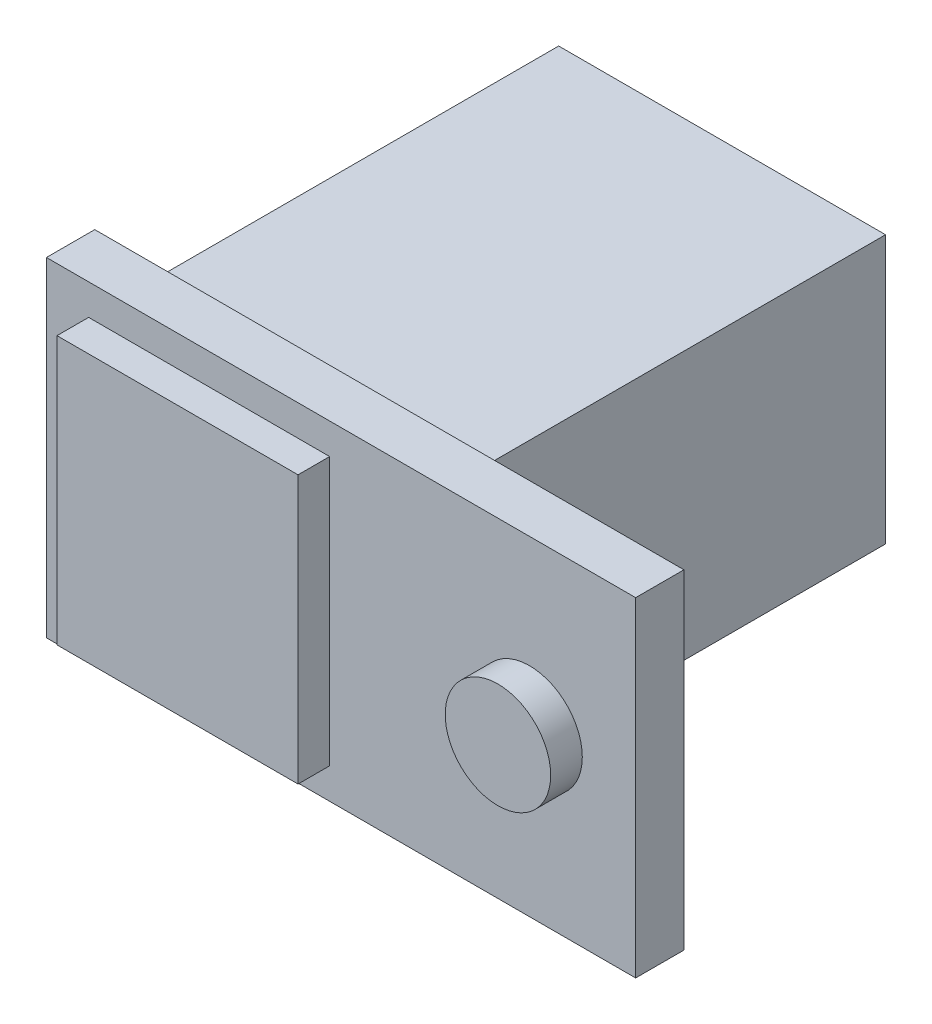
ISO-10303-21;
HEADER;
FILE_DESCRIPTION(('STEP AP214'),'2;1');
FILE_NAME('part.step','',(''),(''),'','','');
FILE_SCHEMA(('AUTOMOTIVE_DESIGN { 1 0 10303 214 1 1 1 1 }'));
ENDSEC;
DATA;
#1=APPLICATION_CONTEXT('core data for automotive mechanical design processes');
#2=APPLICATION_PROTOCOL_DEFINITION('international standard','automotive_design',2000,#1);
#3=PRODUCT_CONTEXT('',#1,'mechanical');
#4=PRODUCT('Part','Part','',(#3));
#5=PRODUCT_RELATED_PRODUCT_CATEGORY('part','',(#4));
#6=PRODUCT_DEFINITION_FORMATION('','',#4);
#7=PRODUCT_DEFINITION_CONTEXT('part definition',#1,'design');
#8=PRODUCT_DEFINITION('design','',#6,#7);
#9=PRODUCT_DEFINITION_SHAPE('','',#8);
#10=(LENGTH_UNIT() NAMED_UNIT(*) SI_UNIT(.MILLI.,.METRE.));
#11=(NAMED_UNIT(*) PLANE_ANGLE_UNIT() SI_UNIT($,.RADIAN.));
#12=(NAMED_UNIT(*) SI_UNIT($,.STERADIAN.) SOLID_ANGLE_UNIT());
#13=UNCERTAINTY_MEASURE_WITH_UNIT(LENGTH_MEASURE(1.E-05),#10,'distance_accuracy_value','');
#14=(GEOMETRIC_REPRESENTATION_CONTEXT(3) GLOBAL_UNCERTAINTY_ASSIGNED_CONTEXT((#13)) GLOBAL_UNIT_ASSIGNED_CONTEXT((#10,
#11,#12)) REPRESENTATION_CONTEXT('',''));
#15=CARTESIAN_POINT('',(0.,0.,0.));
#16=DIRECTION('',(0.,0.,1.));
#17=DIRECTION('',(1.,0.,0.));
#18=AXIS2_PLACEMENT_3D('',#15,#16,#17);
#19=CARTESIAN_POINT('',(7.715,7.81,3.79));
#20=DIRECTION('',(0.,0.,1.));
#21=DIRECTION('',(1.,0.,0.));
#22=AXIS2_PLACEMENT_3D('',#19,#20,#21);
#23=PLANE('',#22);
#24=DIRECTION('',(0.,1.,0.));
#25=VECTOR('',#24,1.);
#26=CARTESIAN_POINT('',(2.,1.46,3.79));
#27=LINE('',#26,#25);
#28=CARTESIAN_POINT('',(2.,1.46,3.79));
#29=VERTEX_POINT('',#28);
#30=CARTESIAN_POINT('',(2.,14.16,3.79));
#31=VERTEX_POINT('',#30);
#32=EDGE_CURVE('E129',#29,#31,#27,.T.);
#33=ORIENTED_EDGE('',*,*,#32,.F.);
#34=DIRECTION('',(1.,0.,0.));
#35=VECTOR('',#34,1.);
#36=CARTESIAN_POINT('',(13.43,1.46,3.79));
#37=LINE('',#36,#35);
#38=CARTESIAN_POINT('',(13.43,1.46,3.79));
#39=VERTEX_POINT('',#38);
#40=EDGE_CURVE('E131',#39,#29,#37,.F.);
#41=ORIENTED_EDGE('',*,*,#40,.F.);
#42=DIRECTION('',(0.,1.,0.));
#43=VECTOR('',#42,1.);
#44=CARTESIAN_POINT('',(13.43,14.16,3.79));
#45=LINE('',#44,#43);
#46=CARTESIAN_POINT('',(13.43,14.16,3.79));
#47=VERTEX_POINT('',#46);
#48=EDGE_CURVE('E133',#47,#39,#45,.F.);
#49=ORIENTED_EDGE('',*,*,#48,.F.);
#50=DIRECTION('',(1.,0.,0.));
#51=VECTOR('',#50,1.);
#52=CARTESIAN_POINT('',(2.,14.16,3.79));
#53=LINE('',#52,#51);
#54=EDGE_CURVE('E193',#31,#47,#53,.T.);
#55=ORIENTED_EDGE('',*,*,#54,.F.);
#56=EDGE_LOOP('',(#33,#41,#49,#55));
#57=FACE_BOUND('',#56,.T.);
#58=ADVANCED_FACE('F17',(#57),#23,.T.);
#59=CARTESIAN_POINT('',(22.91,7.81,3.79));
#60=DIRECTION('',(0.,0.,-1.));
#61=DIRECTION('',(-1.,0.,0.));
#62=AXIS2_PLACEMENT_3D('',#59,#60,#61);
#63=PLANE('',#62);
#64=CARTESIAN_POINT('',(22.91,7.81,3.79));
#65=DIRECTION('',(0.,0.,1.));
#66=DIRECTION('',(1.,0.,0.));
#67=AXIS2_PLACEMENT_3D('',#64,#65,#66);
#68=CIRCLE('',#67,2.5);
#69=CARTESIAN_POINT('',(25.41,7.81,3.79));
#70=VERTEX_POINT('',#69);
#71=EDGE_CURVE('E20',#70,#70,#68,.F.);
#72=ORIENTED_EDGE('',*,*,#71,.F.);
#73=EDGE_LOOP('',(#72));
#74=FACE_BOUND('',#73,.T.);
#75=ADVANCED_FACE('F378',(#74),#63,.F.);
#76=CARTESIAN_POINT('',(13.43,14.16,2.29));
#77=DIRECTION('',(1.,0.,0.));
#78=DIRECTION('',(0.,0.,-1.));
#79=AXIS2_PLACEMENT_3D('',#76,#77,#78);
#80=PLANE('',#79);
#81=DIRECTION('',(0.,1.,0.));
#82=VECTOR('',#81,1.);
#83=CARTESIAN_POINT('',(13.43,7.81,2.29));
#84=LINE('',#83,#82);
#85=CARTESIAN_POINT('',(13.43,14.16,2.29));
#86=VERTEX_POINT('',#85);
#87=CARTESIAN_POINT('',(13.43,1.46,2.29));
#88=VERTEX_POINT('',#87);
#89=EDGE_CURVE('E185',#86,#88,#84,.F.);
#90=ORIENTED_EDGE('',*,*,#89,.F.);
#91=DIRECTION('',(0.,0.,1.));
#92=VECTOR('',#91,1.);
#93=CARTESIAN_POINT('',(13.43,14.16,2.29));
#94=LINE('',#93,#92);
#95=EDGE_CURVE('E145',#47,#86,#94,.F.);
#96=ORIENTED_EDGE('',*,*,#95,.F.);
#97=ORIENTED_EDGE('',*,*,#48,.T.);
#98=DIRECTION('',(0.,0.,-1.));
#99=VECTOR('',#98,1.);
#100=CARTESIAN_POINT('',(13.43,1.46,2.29));
#101=LINE('',#100,#99);
#102=EDGE_CURVE('E139',#88,#39,#101,.F.);
#103=ORIENTED_EDGE('',*,*,#102,.F.);
#104=EDGE_LOOP('',(#90,#96,#97,#103));
#105=FACE_BOUND('',#104,.T.);
#106=ADVANCED_FACE('F142',(#105),#80,.T.);
#107=CARTESIAN_POINT('',(13.43,1.46,2.29));
#108=DIRECTION('',(0.,-1.,0.));
#109=DIRECTION('',(0.,0.,-1.));
#110=AXIS2_PLACEMENT_3D('',#107,#108,#109);
#111=PLANE('',#110);
#112=DIRECTION('',(1.,0.,0.));
#113=VECTOR('',#112,1.);
#114=CARTESIAN_POINT('',(13.97,1.46,2.29));
#115=LINE('',#114,#113);
#116=CARTESIAN_POINT('',(2.,1.46,2.29));
#117=VERTEX_POINT('',#116);
#118=EDGE_CURVE('E151',#88,#117,#115,.F.);
#119=ORIENTED_EDGE('',*,*,#118,.F.);
#120=ORIENTED_EDGE('',*,*,#102,.T.);
#121=ORIENTED_EDGE('',*,*,#40,.T.);
#122=DIRECTION('',(0.,0.,1.));
#123=VECTOR('',#122,1.);
#124=CARTESIAN_POINT('',(2.,1.46,2.29));
#125=LINE('',#124,#123);
#126=EDGE_CURVE('E157',#117,#29,#125,.T.);
#127=ORIENTED_EDGE('',*,*,#126,.F.);
#128=EDGE_LOOP('',(#119,#120,#121,#127));
#129=FACE_BOUND('',#128,.T.);
#130=ADVANCED_FACE('F149',(#129),#111,.T.);
#131=CARTESIAN_POINT('',(2.,1.46,2.29));
#132=DIRECTION('',(-1.,0.,0.));
#133=DIRECTION('',(0.,0.,1.));
#134=AXIS2_PLACEMENT_3D('',#131,#132,#133);
#135=PLANE('',#134);
#136=DIRECTION('',(0.,1.,0.));
#137=VECTOR('',#136,1.);
#138=CARTESIAN_POINT('',(2.,7.81,2.29));
#139=LINE('',#138,#137);
#140=CARTESIAN_POINT('',(2.,14.16,2.29));
#141=VERTEX_POINT('',#140);
#142=EDGE_CURVE('E175',#117,#141,#139,.T.);
#143=ORIENTED_EDGE('',*,*,#142,.F.);
#144=ORIENTED_EDGE('',*,*,#126,.T.);
#145=ORIENTED_EDGE('',*,*,#32,.T.);
#146=DIRECTION('',(0.,0.,1.));
#147=VECTOR('',#146,1.);
#148=CARTESIAN_POINT('',(2.,14.16,2.29));
#149=LINE('',#148,#147);
#150=EDGE_CURVE('E187',#141,#31,#149,.T.);
#151=ORIENTED_EDGE('',*,*,#150,.F.);
#152=EDGE_LOOP('',(#143,#144,#145,#151));
#153=FACE_BOUND('',#152,.T.);
#154=ADVANCED_FACE('F199',(#153),#135,.T.);
#155=CARTESIAN_POINT('',(2.,14.16,2.29));
#156=DIRECTION('',(0.,1.,0.));
#157=DIRECTION('',(0.,0.,1.));
#158=AXIS2_PLACEMENT_3D('',#155,#156,#157);
#159=PLANE('',#158);
#160=DIRECTION('',(1.,0.,0.));
#161=VECTOR('',#160,1.);
#162=CARTESIAN_POINT('',(13.97,14.16,2.29));
#163=LINE('',#162,#161);
#164=EDGE_CURVE('E164',#141,#86,#163,.T.);
#165=ORIENTED_EDGE('',*,*,#164,.F.);
#166=ORIENTED_EDGE('',*,*,#150,.T.);
#167=ORIENTED_EDGE('',*,*,#54,.T.);
#168=ORIENTED_EDGE('',*,*,#95,.T.);
#169=EDGE_LOOP('',(#165,#166,#167,#168));
#170=FACE_BOUND('',#169,.T.);
#171=ADVANCED_FACE('F203',(#170),#159,.T.);
#172=CARTESIAN_POINT('',(22.91,7.81,2.29));
#173=DIRECTION('',(0.,0.,1.));
#174=DIRECTION('',(1.,0.,0.));
#175=AXIS2_PLACEMENT_3D('',#172,#173,#174);
#176=CYLINDRICAL_SURFACE('',#175,2.5);
#177=CARTESIAN_POINT('',(22.91,7.81,2.29));
#178=DIRECTION('',(0.,0.,1.));
#179=DIRECTION('',(1.,0.,0.));
#180=AXIS2_PLACEMENT_3D('',#177,#178,#179);
#181=CIRCLE('',#180,2.5);
#182=CARTESIAN_POINT('',(25.41,7.81,2.29));
#183=VERTEX_POINT('',#182);
#184=EDGE_CURVE('E160',#183,#183,#181,.F.);
#185=ORIENTED_EDGE('',*,*,#184,.F.);
#186=EDGE_LOOP('',(#185));
#187=FACE_BOUND('',#186,.T.);
#188=ORIENTED_EDGE('',*,*,#71,.T.);
#189=EDGE_LOOP('',(#188));
#190=FACE_BOUND('',#189,.T.);
#191=ADVANCED_FACE('F205',(#187,#190),#176,.T.);
#192=CARTESIAN_POINT('',(13.97,7.81,2.29));
#193=DIRECTION('',(0.,0.,1.));
#194=DIRECTION('',(1.,0.,0.));
#195=AXIS2_PLACEMENT_3D('',#192,#193,#194);
#196=PLANE('',#195);
#197=ORIENTED_EDGE('',*,*,#184,.T.);
#198=EDGE_LOOP('',(#197));
#199=FACE_BOUND('',#198,.T.);
#200=ORIENTED_EDGE('',*,*,#142,.T.);
#201=ORIENTED_EDGE('',*,*,#164,.T.);
#202=ORIENTED_EDGE('',*,*,#89,.T.);
#203=ORIENTED_EDGE('',*,*,#118,.T.);
#204=EDGE_LOOP('',(#200,#201,#202,#203));
#205=FACE_BOUND('',#204,.T.);
#206=DIRECTION('',(0.,1.,0.));
#207=VECTOR('',#206,1.);
#208=CARTESIAN_POINT('',(27.94,15.62,2.29));
#209=LINE('',#208,#207);
#210=CARTESIAN_POINT('',(27.94,15.62,2.29));
#211=VERTEX_POINT('',#210);
#212=CARTESIAN_POINT('',(27.94,0.,2.29));
#213=VERTEX_POINT('',#212);
#214=EDGE_CURVE('E163',#211,#213,#209,.F.);
#215=ORIENTED_EDGE('',*,*,#214,.F.);
#216=DIRECTION('',(1.,0.,0.));
#217=VECTOR('',#216,1.);
#218=CARTESIAN_POINT('',(0.,15.62,2.29));
#219=LINE('',#218,#217);
#220=CARTESIAN_POINT('',(0.,15.62,2.29));
#221=VERTEX_POINT('',#220);
#222=EDGE_CURVE('E171',#221,#211,#219,.T.);
#223=ORIENTED_EDGE('',*,*,#222,.F.);
#224=DIRECTION('',(0.,1.,0.));
#225=VECTOR('',#224,1.);
#226=CARTESIAN_POINT('',(0.,0.,2.29));
#227=LINE('',#226,#225);
#228=CARTESIAN_POINT('',(0.,0.,2.29));
#229=VERTEX_POINT('',#228);
#230=EDGE_CURVE('E460',#229,#221,#227,.T.);
#231=ORIENTED_EDGE('',*,*,#230,.F.);
#232=DIRECTION('',(1.,0.,0.));
#233=VECTOR('',#232,1.);
#234=CARTESIAN_POINT('',(27.94,0.,2.29));
#235=LINE('',#234,#233);
#236=EDGE_CURVE('E445',#213,#229,#235,.F.);
#237=ORIENTED_EDGE('',*,*,#236,.F.);
#238=EDGE_LOOP('',(#215,#223,#231,#237));
#239=FACE_BOUND('',#238,.T.);
#240=ADVANCED_FACE('F200',(#199,#205,#239),#196,.T.);
#241=CARTESIAN_POINT('',(27.94,15.62,0.));
#242=DIRECTION('',(1.,0.,0.));
#243=DIRECTION('',(0.,0.,-1.));
#244=AXIS2_PLACEMENT_3D('',#241,#242,#243);
#245=PLANE('',#244);
#246=DIRECTION('',(0.,1.,0.));
#247=VECTOR('',#246,1.);
#248=CARTESIAN_POINT('',(27.94,7.81,0.));
#249=LINE('',#248,#247);
#250=CARTESIAN_POINT('',(27.94,0.,0.));
#251=VERTEX_POINT('',#250);
#252=CARTESIAN_POINT('',(27.94,15.62,0.));
#253=VERTEX_POINT('',#252);
#254=EDGE_CURVE('E473',#251,#253,#249,.T.);
#255=ORIENTED_EDGE('',*,*,#254,.T.);
#256=DIRECTION('',(0.,0.,1.));
#257=VECTOR('',#256,1.);
#258=CARTESIAN_POINT('',(27.94,15.62,0.));
#259=LINE('',#258,#257);
#260=EDGE_CURVE('E464',#211,#253,#259,.F.);
#261=ORIENTED_EDGE('',*,*,#260,.F.);
#262=ORIENTED_EDGE('',*,*,#214,.T.);
#263=DIRECTION('',(0.,0.,-1.));
#264=VECTOR('',#263,1.);
#265=CARTESIAN_POINT('',(27.94,0.,0.));
#266=LINE('',#265,#264);
#267=EDGE_CURVE('E439',#251,#213,#266,.F.);
#268=ORIENTED_EDGE('',*,*,#267,.F.);
#269=EDGE_LOOP('',(#255,#261,#262,#268));
#270=FACE_BOUND('',#269,.T.);
#271=ADVANCED_FACE('F253',(#270),#245,.T.);
#272=CARTESIAN_POINT('',(0.,15.62,0.));
#273=DIRECTION('',(0.,1.,0.));
#274=DIRECTION('',(0.,0.,1.));
#275=AXIS2_PLACEMENT_3D('',#272,#273,#274);
#276=PLANE('',#275);
#277=DIRECTION('',(1.,0.,0.));
#278=VECTOR('',#277,1.);
#279=CARTESIAN_POINT('',(13.97,15.62,0.));
#280=LINE('',#279,#278);
#281=CARTESIAN_POINT('',(0.,15.62,0.));
#282=VERTEX_POINT('',#281);
#283=EDGE_CURVE('E476',#253,#282,#280,.F.);
#284=ORIENTED_EDGE('',*,*,#283,.T.);
#285=DIRECTION('',(0.,0.,1.));
#286=VECTOR('',#285,1.);
#287=CARTESIAN_POINT('',(0.,15.62,0.));
#288=LINE('',#287,#286);
#289=EDGE_CURVE('E448',#221,#282,#288,.F.);
#290=ORIENTED_EDGE('',*,*,#289,.F.);
#291=ORIENTED_EDGE('',*,*,#222,.T.);
#292=ORIENTED_EDGE('',*,*,#260,.T.);
#293=EDGE_LOOP('',(#284,#290,#291,#292));
#294=FACE_BOUND('',#293,.T.);
#295=ADVANCED_FACE('F249',(#294),#276,.T.);
#296=CARTESIAN_POINT('',(0.,0.,0.));
#297=DIRECTION('',(-1.,0.,0.));
#298=DIRECTION('',(0.,0.,1.));
#299=AXIS2_PLACEMENT_3D('',#296,#297,#298);
#300=PLANE('',#299);
#301=DIRECTION('',(0.,1.,0.));
#302=VECTOR('',#301,1.);
#303=CARTESIAN_POINT('',(0.,7.81,0.));
#304=LINE('',#303,#302);
#305=CARTESIAN_POINT('',(0.,0.,0.));
#306=VERTEX_POINT('',#305);
#307=EDGE_CURVE('E481',#282,#306,#304,.F.);
#308=ORIENTED_EDGE('',*,*,#307,.T.);
#309=DIRECTION('',(0.,0.,-1.));
#310=VECTOR('',#309,1.);
#311=CARTESIAN_POINT('',(0.,0.,0.));
#312=LINE('',#311,#310);
#313=EDGE_CURVE('E443',#229,#306,#312,.T.);
#314=ORIENTED_EDGE('',*,*,#313,.F.);
#315=ORIENTED_EDGE('',*,*,#230,.T.);
#316=ORIENTED_EDGE('',*,*,#289,.T.);
#317=EDGE_LOOP('',(#308,#314,#315,#316));
#318=FACE_BOUND('',#317,.T.);
#319=ADVANCED_FACE('F245',(#318),#300,.T.);
#320=CARTESIAN_POINT('',(27.94,0.,0.));
#321=DIRECTION('',(0.,-1.,0.));
#322=DIRECTION('',(0.,0.,-1.));
#323=AXIS2_PLACEMENT_3D('',#320,#321,#322);
#324=PLANE('',#323);
#325=DIRECTION('',(1.,0.,0.));
#326=VECTOR('',#325,1.);
#327=CARTESIAN_POINT('',(13.97,0.,0.));
#328=LINE('',#327,#326);
#329=EDGE_CURVE('E517',#306,#251,#328,.T.);
#330=ORIENTED_EDGE('',*,*,#329,.T.);
#331=ORIENTED_EDGE('',*,*,#267,.T.);
#332=ORIENTED_EDGE('',*,*,#236,.T.);
#333=ORIENTED_EDGE('',*,*,#313,.T.);
#334=EDGE_LOOP('',(#330,#331,#332,#333));
#335=FACE_BOUND('',#334,.T.);
#336=ADVANCED_FACE('F241',(#335),#324,.T.);
#337=CARTESIAN_POINT('',(17.5,14.16,0.));
#338=DIRECTION('',(0.,1.,0.));
#339=DIRECTION('',(0.,0.,1.));
#340=AXIS2_PLACEMENT_3D('',#337,#338,#339);
#341=PLANE('',#340);
#342=DIRECTION('',(1.,0.,0.));
#343=VECTOR('',#342,1.);
#344=CARTESIAN_POINT('',(13.97,14.16,0.));
#345=LINE('',#344,#343);
#346=CARTESIAN_POINT('',(2.,14.16,0.));
#347=VERTEX_POINT('',#346);
#348=CARTESIAN_POINT('',(17.5,14.16,0.));
#349=VERTEX_POINT('',#348);
#350=EDGE_CURVE('E514',#347,#349,#345,.T.);
#351=ORIENTED_EDGE('',*,*,#350,.T.);
#352=DIRECTION('',(0.,0.,-1.));
#353=VECTOR('',#352,1.);
#354=CARTESIAN_POINT('',(17.5,14.16,0.));
#355=LINE('',#354,#353);
#356=CARTESIAN_POINT('',(17.5,14.16,-20.));
#357=VERTEX_POINT('',#356);
#358=EDGE_CURVE('E477',#357,#349,#355,.F.);
#359=ORIENTED_EDGE('',*,*,#358,.F.);
#360=DIRECTION('',(1.,0.,0.));
#361=VECTOR('',#360,1.);
#362=CARTESIAN_POINT('',(9.75,14.16,-20.));
#363=LINE('',#362,#361);
#364=CARTESIAN_POINT('',(2.,14.16,-20.));
#365=VERTEX_POINT('',#364);
#366=EDGE_CURVE('E442',#357,#365,#363,.F.);
#367=ORIENTED_EDGE('',*,*,#366,.T.);
#368=DIRECTION('',(0.,0.,1.));
#369=VECTOR('',#368,1.);
#370=CARTESIAN_POINT('',(2.,14.16,0.));
#371=LINE('',#370,#369);
#372=EDGE_CURVE('E497',#347,#365,#371,.F.);
#373=ORIENTED_EDGE('',*,*,#372,.F.);
#374=EDGE_LOOP('',(#351,#359,#367,#373));
#375=FACE_BOUND('',#374,.T.);
#376=ADVANCED_FACE('F237',(#375),#341,.T.);
#377=CARTESIAN_POINT('',(9.75,7.81,-20.));
#378=DIRECTION('',(0.,0.,1.));
#379=DIRECTION('',(1.,0.,0.));
#380=AXIS2_PLACEMENT_3D('',#377,#378,#379);
#381=PLANE('',#380);
#382=ORIENTED_EDGE('',*,*,#366,.F.);
#383=DIRECTION('',(0.,1.,0.));
#384=VECTOR('',#383,1.);
#385=CARTESIAN_POINT('',(17.5,1.46,-20.));
#386=LINE('',#385,#384);
#387=CARTESIAN_POINT('',(17.5,1.46,-20.));
#388=VERTEX_POINT('',#387);
#389=EDGE_CURVE('E485',#388,#357,#386,.T.);
#390=ORIENTED_EDGE('',*,*,#389,.F.);
#391=DIRECTION('',(1.,0.,0.));
#392=VECTOR('',#391,1.);
#393=CARTESIAN_POINT('',(2.,1.46,-20.));
#394=LINE('',#393,#392);
#395=CARTESIAN_POINT('',(2.,1.46,-20.));
#396=VERTEX_POINT('',#395);
#397=EDGE_CURVE('E501',#396,#388,#394,.T.);
#398=ORIENTED_EDGE('',*,*,#397,.F.);
#399=DIRECTION('',(0.,1.,0.));
#400=VECTOR('',#399,1.);
#401=CARTESIAN_POINT('',(2.,14.16,-20.));
#402=LINE('',#401,#400);
#403=EDGE_CURVE('E499',#365,#396,#402,.F.);
#404=ORIENTED_EDGE('',*,*,#403,.F.);
#405=EDGE_LOOP('',(#382,#390,#398,#404));
#406=FACE_BOUND('',#405,.T.);
#407=ADVANCED_FACE('F233',(#406),#381,.F.);
#408=CARTESIAN_POINT('',(17.5,1.46,0.));
#409=DIRECTION('',(1.,0.,0.));
#410=DIRECTION('',(0.,0.,-1.));
#411=AXIS2_PLACEMENT_3D('',#408,#409,#410);
#412=PLANE('',#411);
#413=DIRECTION('',(0.,1.,0.));
#414=VECTOR('',#413,1.);
#415=CARTESIAN_POINT('',(17.5,7.81,0.));
#416=LINE('',#415,#414);
#417=CARTESIAN_POINT('',(17.5,1.46,0.));
#418=VERTEX_POINT('',#417);
#419=EDGE_CURVE('E502',#349,#418,#416,.F.);
#420=ORIENTED_EDGE('',*,*,#419,.T.);
#421=DIRECTION('',(0.,0.,-1.));
#422=VECTOR('',#421,1.);
#423=CARTESIAN_POINT('',(17.5,1.46,0.));
#424=LINE('',#423,#422);
#425=EDGE_CURVE('E507',#388,#418,#424,.F.);
#426=ORIENTED_EDGE('',*,*,#425,.F.);
#427=ORIENTED_EDGE('',*,*,#389,.T.);
#428=ORIENTED_EDGE('',*,*,#358,.T.);
#429=EDGE_LOOP('',(#420,#426,#427,#428));
#430=FACE_BOUND('',#429,.T.);
#431=ADVANCED_FACE('F230',(#430),#412,.T.);
#432=CARTESIAN_POINT('',(13.97,7.81,0.));
#433=DIRECTION('',(0.,0.,1.));
#434=DIRECTION('',(1.,0.,0.));
#435=AXIS2_PLACEMENT_3D('',#432,#433,#434);
#436=PLANE('',#435);
#437=DIRECTION('',(1.,0.,0.));
#438=VECTOR('',#437,1.);
#439=CARTESIAN_POINT('',(2.,1.46,0.));
#440=LINE('',#439,#438);
#441=CARTESIAN_POINT('',(2.,1.46,0.));
#442=VERTEX_POINT('',#441);
#443=EDGE_CURVE('E27',#418,#442,#440,.F.);
#444=ORIENTED_EDGE('',*,*,#443,.F.);
#445=ORIENTED_EDGE('',*,*,#419,.F.);
#446=ORIENTED_EDGE('',*,*,#350,.F.);
#447=DIRECTION('',(0.,1.,0.));
#448=VECTOR('',#447,1.);
#449=CARTESIAN_POINT('',(2.,14.16,0.));
#450=LINE('',#449,#448);
#451=EDGE_CURVE('E40',#442,#347,#450,.T.);
#452=ORIENTED_EDGE('',*,*,#451,.F.);
#453=EDGE_LOOP('',(#444,#445,#446,#452));
#454=FACE_BOUND('',#453,.T.);
#455=ORIENTED_EDGE('',*,*,#307,.F.);
#456=ORIENTED_EDGE('',*,*,#283,.F.);
#457=ORIENTED_EDGE('',*,*,#254,.F.);
#458=ORIENTED_EDGE('',*,*,#329,.F.);
#459=EDGE_LOOP('',(#455,#456,#457,#458));
#460=FACE_BOUND('',#459,.T.);
#461=ADVANCED_FACE('F223',(#454,#460),#436,.F.);
#462=CARTESIAN_POINT('',(2.,14.16,0.));
#463=DIRECTION('',(-1.,0.,0.));
#464=DIRECTION('',(0.,0.,1.));
#465=AXIS2_PLACEMENT_3D('',#462,#463,#464);
#466=PLANE('',#465);
#467=ORIENTED_EDGE('',*,*,#451,.T.);
#468=ORIENTED_EDGE('',*,*,#372,.T.);
#469=ORIENTED_EDGE('',*,*,#403,.T.);
#470=DIRECTION('',(0.,0.,-1.));
#471=VECTOR('',#470,1.);
#472=CARTESIAN_POINT('',(2.,1.46,0.));
#473=LINE('',#472,#471);
#474=EDGE_CURVE('E11',#442,#396,#473,.T.);
#475=ORIENTED_EDGE('',*,*,#474,.F.);
#476=EDGE_LOOP('',(#467,#468,#469,#475));
#477=FACE_BOUND('',#476,.T.);
#478=ADVANCED_FACE('F217',(#477),#466,.T.);
#479=CARTESIAN_POINT('',(2.,1.46,0.));
#480=DIRECTION('',(0.,-1.,0.));
#481=DIRECTION('',(0.,0.,-1.));
#482=AXIS2_PLACEMENT_3D('',#479,#480,#481);
#483=PLANE('',#482);
#484=ORIENTED_EDGE('',*,*,#443,.T.);
#485=ORIENTED_EDGE('',*,*,#474,.T.);
#486=ORIENTED_EDGE('',*,*,#397,.T.);
#487=ORIENTED_EDGE('',*,*,#425,.T.);
#488=EDGE_LOOP('',(#484,#485,#486,#487));
#489=FACE_BOUND('',#488,.T.);
#490=ADVANCED_FACE('F215',(#489),#483,.T.);
#491=CLOSED_SHELL('',(#58,#75,#106,#130,#154,#171,#191,#240,#271,#295,#319,#336,#376,#407,#431,
#461,#478,#490));
#492=MANIFOLD_SOLID_BREP('B1',#491);
#493=ADVANCED_BREP_SHAPE_REPRESENTATION('',(#18,#492),#14);
#494=SHAPE_DEFINITION_REPRESENTATION(#9,#493);
ENDSEC;
END-ISO-10303-21;
